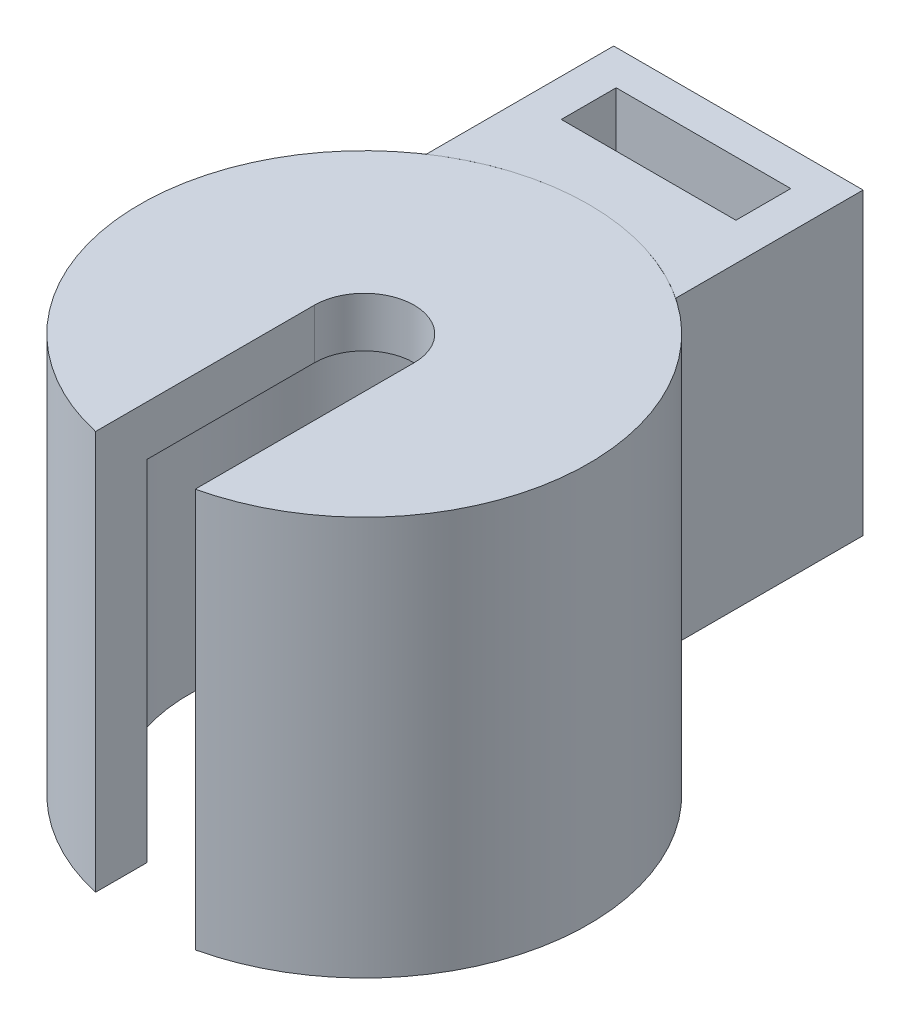
ISO-10303-21;
HEADER;
FILE_DESCRIPTION(('STEP AP214'),'2;1');
FILE_NAME('part.step','',(''),(''),'','','');
FILE_SCHEMA(('AUTOMOTIVE_DESIGN { 1 0 10303 214 1 1 1 1 }'));
ENDSEC;
DATA;
#1=APPLICATION_CONTEXT('core data for automotive mechanical design processes');
#2=APPLICATION_PROTOCOL_DEFINITION('international standard','automotive_design',2000,#1);
#3=PRODUCT_CONTEXT('',#1,'mechanical');
#4=PRODUCT('Part','Part','',(#3));
#5=PRODUCT_RELATED_PRODUCT_CATEGORY('part','',(#4));
#6=PRODUCT_DEFINITION_FORMATION('','',#4);
#7=PRODUCT_DEFINITION_CONTEXT('part definition',#1,'design');
#8=PRODUCT_DEFINITION('design','',#6,#7);
#9=PRODUCT_DEFINITION_SHAPE('','',#8);
#10=(LENGTH_UNIT() NAMED_UNIT(*) SI_UNIT(.MILLI.,.METRE.));
#11=(NAMED_UNIT(*) PLANE_ANGLE_UNIT() SI_UNIT($,.RADIAN.));
#12=(NAMED_UNIT(*) SI_UNIT($,.STERADIAN.) SOLID_ANGLE_UNIT());
#13=UNCERTAINTY_MEASURE_WITH_UNIT(LENGTH_MEASURE(1.E-05),#10,'distance_accuracy_value','');
#14=(GEOMETRIC_REPRESENTATION_CONTEXT(3) GLOBAL_UNCERTAINTY_ASSIGNED_CONTEXT((#13)) GLOBAL_UNIT_ASSIGNED_CONTEXT((#10,
#11,#12)) REPRESENTATION_CONTEXT('',''));
#15=CARTESIAN_POINT('',(0.,0.,0.));
#16=DIRECTION('',(0.,0.,1.));
#17=DIRECTION('',(1.,0.,0.));
#18=AXIS2_PLACEMENT_3D('',#15,#16,#17);
#19=CARTESIAN_POINT('',(0.,7.,0.));
#20=DIRECTION('',(0.,-1.,0.));
#21=DIRECTION('',(0.,0.,-1.));
#22=AXIS2_PLACEMENT_3D('',#19,#20,#21);
#23=CYLINDRICAL_SURFACE('',#22,4.5);
#24=CARTESIAN_POINT('',(0.,0.,0.));
#25=DIRECTION('',(0.,1.,0.));
#26=DIRECTION('',(0.,0.,1.));
#27=AXIS2_PLACEMENT_3D('',#24,#25,#26);
#28=CIRCLE('',#27,4.5);
#29=CARTESIAN_POINT('',(1.,0.,4.38748219369606));
#30=VERTEX_POINT('',#29);
#31=CARTESIAN_POINT('',(-1.,0.,4.38748219369606));
#32=VERTEX_POINT('',#31);
#33=EDGE_CURVE('E264',#30,#32,#28,.T.);
#34=ORIENTED_EDGE('',*,*,#33,.T.);
#35=DIRECTION('',(0.,-1.,0.));
#36=VECTOR('',#35,1.);
#37=CARTESIAN_POINT('',(-1.,7.,4.38748219369606));
#38=LINE('',#37,#36);
#39=CARTESIAN_POINT('',(-1.,8.,4.38748219369606));
#40=VERTEX_POINT('',#39);
#41=EDGE_CURVE('E280',#40,#32,#38,.T.);
#42=ORIENTED_EDGE('',*,*,#41,.F.);
#43=CARTESIAN_POINT('',(0.,8.,0.));
#44=DIRECTION('',(0.,1.,0.));
#45=DIRECTION('',(0.,0.,1.));
#46=AXIS2_PLACEMENT_3D('',#43,#44,#45);
#47=CIRCLE('',#46,4.5);
#48=CARTESIAN_POINT('',(1.,8.,4.38748219369606));
#49=VERTEX_POINT('',#48);
#50=EDGE_CURVE('E231',#49,#40,#47,.T.);
#51=ORIENTED_EDGE('',*,*,#50,.F.);
#52=DIRECTION('',(0.,-1.,0.));
#53=VECTOR('',#52,1.);
#54=CARTESIAN_POINT('',(1.,7.,4.38748219369606));
#55=LINE('',#54,#53);
#56=EDGE_CURVE('E283',#49,#30,#55,.T.);
#57=ORIENTED_EDGE('',*,*,#56,.T.);
#58=EDGE_LOOP('',(#34,#42,#51,#57));
#59=FACE_BOUND('',#58,.T.);
#60=DIRECTION('',(0.,-1.,0.));
#61=VECTOR('',#60,1.);
#62=CARTESIAN_POINT('',(-2.5,7.,-3.74165738677394));
#63=LINE('',#62,#61);
#64=CARTESIAN_POINT('',(-2.5,1.999,-3.74165738677394));
#65=VERTEX_POINT('',#64);
#66=CARTESIAN_POINT('',(-2.5,7.999,-3.74165738677394));
#67=VERTEX_POINT('',#66);
#68=EDGE_CURVE('E11',#65,#67,#63,.F.);
#69=ORIENTED_EDGE('',*,*,#68,.F.);
#70=CARTESIAN_POINT('',(0.,1.999,0.));
#71=DIRECTION('',(0.,-1.,0.));
#72=DIRECTION('',(0.,0.,-1.));
#73=AXIS2_PLACEMENT_3D('',#70,#71,#72);
#74=CIRCLE('',#73,4.5);
#75=CARTESIAN_POINT('',(2.5,1.999,-3.74165738677394));
#76=VERTEX_POINT('',#75);
#77=EDGE_CURVE('E214',#65,#76,#74,.T.);
#78=ORIENTED_EDGE('',*,*,#77,.T.);
#79=DIRECTION('',(0.,-1.,0.));
#80=VECTOR('',#79,1.);
#81=CARTESIAN_POINT('',(2.5,7.,-3.74165738677394));
#82=LINE('',#81,#80);
#83=CARTESIAN_POINT('',(2.5,7.999,-3.74165738677394));
#84=VERTEX_POINT('',#83);
#85=EDGE_CURVE('E287',#76,#84,#82,.F.);
#86=ORIENTED_EDGE('',*,*,#85,.T.);
#87=CARTESIAN_POINT('',(0.,7.999,0.));
#88=DIRECTION('',(0.,-1.,0.));
#89=DIRECTION('',(0.,0.,-1.));
#90=AXIS2_PLACEMENT_3D('',#87,#88,#89);
#91=CIRCLE('',#90,4.5);
#92=EDGE_CURVE('E50',#67,#84,#91,.T.);
#93=ORIENTED_EDGE('',*,*,#92,.F.);
#94=EDGE_LOOP('',(#69,#78,#86,#93));
#95=FACE_BOUND('',#94,.T.);
#96=ADVANCED_FACE('F41',(#59,#95),#23,.T.);
#97=CARTESIAN_POINT('',(1.,7.,0.));
#98=DIRECTION('',(1.,0.,0.));
#99=DIRECTION('',(0.,0.,-1.));
#100=AXIS2_PLACEMENT_3D('',#97,#98,#99);
#101=PLANE('',#100);
#102=DIRECTION('',(0.,0.,1.));
#103=VECTOR('',#102,1.);
#104=CARTESIAN_POINT('',(1.,0.,0.));
#105=LINE('',#104,#103);
#106=CARTESIAN_POINT('',(1.,0.,3.35410196624968));
#107=VERTEX_POINT('',#106);
#108=EDGE_CURVE('E255',#107,#30,#105,.T.);
#109=ORIENTED_EDGE('',*,*,#108,.T.);
#110=ORIENTED_EDGE('',*,*,#56,.F.);
#111=DIRECTION('',(0.,0.,1.));
#112=VECTOR('',#111,1.);
#113=CARTESIAN_POINT('',(1.,8.,0.));
#114=LINE('',#113,#112);
#115=CARTESIAN_POINT('',(1.,8.,0.));
#116=VERTEX_POINT('',#115);
#117=EDGE_CURVE('E226',#116,#49,#114,.T.);
#118=ORIENTED_EDGE('',*,*,#117,.F.);
#119=DIRECTION('',(0.,-1.,0.));
#120=VECTOR('',#119,1.);
#121=CARTESIAN_POINT('',(1.,8.,0.));
#122=LINE('',#121,#120);
#123=CARTESIAN_POINT('',(1.,7.,0.));
#124=VERTEX_POINT('',#123);
#125=EDGE_CURVE('E252',#116,#124,#122,.T.);
#126=ORIENTED_EDGE('',*,*,#125,.T.);
#127=DIRECTION('',(0.,0.,1.));
#128=VECTOR('',#127,1.);
#129=CARTESIAN_POINT('',(1.,7.,0.));
#130=LINE('',#129,#128);
#131=CARTESIAN_POINT('',(1.,7.,3.35410196624968));
#132=VERTEX_POINT('',#131);
#133=EDGE_CURVE('E243',#124,#132,#130,.T.);
#134=ORIENTED_EDGE('',*,*,#133,.T.);
#135=DIRECTION('',(0.,-1.,0.));
#136=VECTOR('',#135,1.);
#137=CARTESIAN_POINT('',(1.,7.,3.35410196624968));
#138=LINE('',#137,#136);
#139=EDGE_CURVE('E259',#132,#107,#138,.T.);
#140=ORIENTED_EDGE('',*,*,#139,.T.);
#141=EDGE_LOOP('',(#109,#110,#118,#126,#134,#140));
#142=FACE_BOUND('',#141,.T.);
#143=ADVANCED_FACE('F43',(#142),#101,.F.);
#144=CARTESIAN_POINT('',(-1.,7.,0.));
#145=DIRECTION('',(1.,0.,0.));
#146=DIRECTION('',(0.,0.,-1.));
#147=AXIS2_PLACEMENT_3D('',#144,#145,#146);
#148=PLANE('',#147);
#149=DIRECTION('',(0.,0.,1.));
#150=VECTOR('',#149,1.);
#151=CARTESIAN_POINT('',(-1.,0.,0.));
#152=LINE('',#151,#150);
#153=CARTESIAN_POINT('',(-1.,0.,3.35410196624968));
#154=VERTEX_POINT('',#153);
#155=EDGE_CURVE('E268',#154,#32,#152,.T.);
#156=ORIENTED_EDGE('',*,*,#155,.F.);
#157=DIRECTION('',(0.,-1.,0.));
#158=VECTOR('',#157,1.);
#159=CARTESIAN_POINT('',(-1.,7.,3.35410196624968));
#160=LINE('',#159,#158);
#161=CARTESIAN_POINT('',(-1.,7.,3.35410196624968));
#162=VERTEX_POINT('',#161);
#163=EDGE_CURVE('E277',#162,#154,#160,.T.);
#164=ORIENTED_EDGE('',*,*,#163,.F.);
#165=DIRECTION('',(0.,0.,1.));
#166=VECTOR('',#165,1.);
#167=CARTESIAN_POINT('',(-1.,7.,0.));
#168=LINE('',#167,#166);
#169=CARTESIAN_POINT('',(-1.,7.,0.));
#170=VERTEX_POINT('',#169);
#171=EDGE_CURVE('E227',#170,#162,#168,.T.);
#172=ORIENTED_EDGE('',*,*,#171,.F.);
#173=DIRECTION('',(0.,-1.,0.));
#174=VECTOR('',#173,1.);
#175=CARTESIAN_POINT('',(-1.,8.,0.));
#176=LINE('',#175,#174);
#177=CARTESIAN_POINT('',(-1.,8.,0.));
#178=VERTEX_POINT('',#177);
#179=EDGE_CURVE('E239',#178,#170,#176,.T.);
#180=ORIENTED_EDGE('',*,*,#179,.F.);
#181=DIRECTION('',(0.,0.,1.));
#182=VECTOR('',#181,1.);
#183=CARTESIAN_POINT('',(-1.,8.,0.));
#184=LINE('',#183,#182);
#185=EDGE_CURVE('E235',#178,#40,#184,.T.);
#186=ORIENTED_EDGE('',*,*,#185,.T.);
#187=ORIENTED_EDGE('',*,*,#41,.T.);
#188=EDGE_LOOP('',(#156,#164,#172,#180,#186,#187));
#189=FACE_BOUND('',#188,.T.);
#190=ADVANCED_FACE('F327',(#189),#148,.T.);
#191=CARTESIAN_POINT('',(0.,7.,0.));
#192=DIRECTION('',(0.,-1.,0.));
#193=DIRECTION('',(0.,0.,-1.));
#194=AXIS2_PLACEMENT_3D('',#191,#192,#193);
#195=CYLINDRICAL_SURFACE('',#194,3.5);
#196=CARTESIAN_POINT('',(0.,0.,0.));
#197=DIRECTION('',(0.,1.,0.));
#198=DIRECTION('',(0.,0.,1.));
#199=AXIS2_PLACEMENT_3D('',#196,#197,#198);
#200=CIRCLE('',#199,3.5);
#201=EDGE_CURVE('E260',#107,#154,#200,.T.);
#202=ORIENTED_EDGE('',*,*,#201,.F.);
#203=ORIENTED_EDGE('',*,*,#139,.F.);
#204=CARTESIAN_POINT('',(0.,7.,0.));
#205=DIRECTION('',(0.,1.,0.));
#206=DIRECTION('',(0.,0.,1.));
#207=AXIS2_PLACEMENT_3D('',#204,#205,#206);
#208=CIRCLE('',#207,3.5);
#209=EDGE_CURVE('E256',#132,#162,#208,.T.);
#210=ORIENTED_EDGE('',*,*,#209,.T.);
#211=ORIENTED_EDGE('',*,*,#163,.T.);
#212=EDGE_LOOP('',(#202,#203,#210,#211));
#213=FACE_BOUND('',#212,.T.);
#214=ADVANCED_FACE('F332',(#213),#195,.F.);
#215=CARTESIAN_POINT('',(0.,0.,0.));
#216=DIRECTION('',(0.,1.,0.));
#217=DIRECTION('',(0.,0.,1.));
#218=AXIS2_PLACEMENT_3D('',#215,#216,#217);
#219=PLANE('',#218);
#220=ORIENTED_EDGE('',*,*,#108,.F.);
#221=ORIENTED_EDGE('',*,*,#201,.T.);
#222=ORIENTED_EDGE('',*,*,#155,.T.);
#223=ORIENTED_EDGE('',*,*,#33,.F.);
#224=EDGE_LOOP('',(#220,#221,#222,#223));
#225=FACE_BOUND('',#224,.T.);
#226=ADVANCED_FACE('F336',(#225),#219,.F.);
#227=CARTESIAN_POINT('',(0.,7.,0.));
#228=DIRECTION('',(0.,1.,0.));
#229=DIRECTION('',(0.,0.,1.));
#230=AXIS2_PLACEMENT_3D('',#227,#228,#229);
#231=PLANE('',#230);
#232=ORIENTED_EDGE('',*,*,#209,.F.);
#233=ORIENTED_EDGE('',*,*,#133,.F.);
#234=CARTESIAN_POINT('',(0.,7.,0.));
#235=DIRECTION('',(0.,1.,0.));
#236=DIRECTION('',(0.,0.,1.));
#237=AXIS2_PLACEMENT_3D('',#234,#235,#236);
#238=CIRCLE('',#237,1.);
#239=EDGE_CURVE('E221',#124,#170,#238,.T.);
#240=ORIENTED_EDGE('',*,*,#239,.T.);
#241=ORIENTED_EDGE('',*,*,#171,.T.);
#242=EDGE_LOOP('',(#232,#233,#240,#241));
#243=FACE_BOUND('',#242,.T.);
#244=ADVANCED_FACE('F340',(#243),#231,.F.);
#245=CARTESIAN_POINT('',(0.,8.,0.));
#246=DIRECTION('',(0.,-1.,0.));
#247=DIRECTION('',(0.,0.,-1.));
#248=AXIS2_PLACEMENT_3D('',#245,#246,#247);
#249=CYLINDRICAL_SURFACE('',#248,1.);
#250=ORIENTED_EDGE('',*,*,#239,.F.);
#251=ORIENTED_EDGE('',*,*,#125,.F.);
#252=CARTESIAN_POINT('',(0.,8.,0.));
#253=DIRECTION('',(0.,1.,0.));
#254=DIRECTION('',(0.,0.,1.));
#255=AXIS2_PLACEMENT_3D('',#252,#253,#254);
#256=CIRCLE('',#255,1.);
#257=EDGE_CURVE('E222',#116,#178,#256,.T.);
#258=ORIENTED_EDGE('',*,*,#257,.T.);
#259=ORIENTED_EDGE('',*,*,#179,.T.);
#260=EDGE_LOOP('',(#250,#251,#258,#259));
#261=FACE_BOUND('',#260,.T.);
#262=ADVANCED_FACE('F318',(#261),#249,.F.);
#263=CARTESIAN_POINT('',(0.,8.,0.));
#264=DIRECTION('',(0.,1.,0.));
#265=DIRECTION('',(0.,0.,1.));
#266=AXIS2_PLACEMENT_3D('',#263,#264,#265);
#267=PLANE('',#266);
#268=ORIENTED_EDGE('',*,*,#257,.F.);
#269=ORIENTED_EDGE('',*,*,#117,.T.);
#270=ORIENTED_EDGE('',*,*,#50,.T.);
#271=ORIENTED_EDGE('',*,*,#185,.F.);
#272=EDGE_LOOP('',(#268,#269,#270,#271));
#273=FACE_BOUND('',#272,.T.);
#274=ADVANCED_FACE('F311',(#273),#267,.T.);
#275=CARTESIAN_POINT('',(-2.5,0.,0.));
#276=DIRECTION('',(1.,0.,0.));
#277=DIRECTION('',(0.,0.,-1.));
#278=AXIS2_PLACEMENT_3D('',#275,#276,#277);
#279=PLANE('',#278);
#280=DIRECTION('',(0.,0.,-1.));
#281=VECTOR('',#280,1.);
#282=CARTESIAN_POINT('',(-2.5,1.999,0.));
#283=LINE('',#282,#281);
#284=CARTESIAN_POINT('',(-2.5,1.999,-7.5));
#285=VERTEX_POINT('',#284);
#286=EDGE_CURVE('E206',#65,#285,#283,.T.);
#287=ORIENTED_EDGE('',*,*,#286,.F.);
#288=ORIENTED_EDGE('',*,*,#68,.T.);
#289=DIRECTION('',(0.,0.,-1.));
#290=VECTOR('',#289,1.);
#291=CARTESIAN_POINT('',(-2.5,7.999,0.));
#292=LINE('',#291,#290);
#293=CARTESIAN_POINT('',(-2.5,7.999,-7.5));
#294=VERTEX_POINT('',#293);
#295=EDGE_CURVE('E203',#67,#294,#292,.T.);
#296=ORIENTED_EDGE('',*,*,#295,.T.);
#297=DIRECTION('',(0.,-1.,0.));
#298=VECTOR('',#297,1.);
#299=CARTESIAN_POINT('',(-2.5,0.,-7.5));
#300=LINE('',#299,#298);
#301=EDGE_CURVE('E199',#294,#285,#300,.T.);
#302=ORIENTED_EDGE('',*,*,#301,.T.);
#303=EDGE_LOOP('',(#287,#288,#296,#302));
#304=FACE_BOUND('',#303,.T.);
#305=ADVANCED_FACE('F309',(#304),#279,.F.);
#306=CARTESIAN_POINT('',(2.5,0.,0.));
#307=DIRECTION('',(1.,0.,0.));
#308=DIRECTION('',(0.,0.,-1.));
#309=AXIS2_PLACEMENT_3D('',#306,#307,#308);
#310=PLANE('',#309);
#311=ORIENTED_EDGE('',*,*,#85,.F.);
#312=DIRECTION('',(0.,0.,-1.));
#313=VECTOR('',#312,1.);
#314=CARTESIAN_POINT('',(2.5,1.999,0.));
#315=LINE('',#314,#313);
#316=CARTESIAN_POINT('',(2.5,1.999,-7.5));
#317=VERTEX_POINT('',#316);
#318=EDGE_CURVE('E196',#76,#317,#315,.T.);
#319=ORIENTED_EDGE('',*,*,#318,.T.);
#320=DIRECTION('',(0.,-1.,0.));
#321=VECTOR('',#320,1.);
#322=CARTESIAN_POINT('',(2.5,0.,-7.5));
#323=LINE('',#322,#321);
#324=CARTESIAN_POINT('',(2.5,7.999,-7.5));
#325=VERTEX_POINT('',#324);
#326=EDGE_CURVE('E189',#325,#317,#323,.T.);
#327=ORIENTED_EDGE('',*,*,#326,.F.);
#328=DIRECTION('',(0.,0.,-1.));
#329=VECTOR('',#328,1.);
#330=CARTESIAN_POINT('',(2.5,7.999,0.));
#331=LINE('',#330,#329);
#332=EDGE_CURVE('E193',#84,#325,#331,.T.);
#333=ORIENTED_EDGE('',*,*,#332,.F.);
#334=EDGE_LOOP('',(#311,#319,#327,#333));
#335=FACE_BOUND('',#334,.T.);
#336=ADVANCED_FACE('F299',(#335),#310,.T.);
#337=CARTESIAN_POINT('',(-2.5,0.,-7.5));
#338=DIRECTION('',(0.,0.,1.));
#339=DIRECTION('',(0.,-1.,0.));
#340=AXIS2_PLACEMENT_3D('',#337,#338,#339);
#341=PLANE('',#340);
#342=DIRECTION('',(1.,0.,0.));
#343=VECTOR('',#342,1.);
#344=CARTESIAN_POINT('',(-2.5,7.999,-7.5));
#345=LINE('',#344,#343);
#346=EDGE_CURVE('E209',#294,#325,#345,.T.);
#347=ORIENTED_EDGE('',*,*,#346,.T.);
#348=ORIENTED_EDGE('',*,*,#326,.T.);
#349=DIRECTION('',(1.,0.,0.));
#350=VECTOR('',#349,1.);
#351=CARTESIAN_POINT('',(-2.5,1.999,-7.5));
#352=LINE('',#351,#350);
#353=EDGE_CURVE('E210',#285,#317,#352,.T.);
#354=ORIENTED_EDGE('',*,*,#353,.F.);
#355=ORIENTED_EDGE('',*,*,#301,.F.);
#356=EDGE_LOOP('',(#347,#348,#354,#355));
#357=FACE_BOUND('',#356,.T.);
#358=ADVANCED_FACE('F307',(#357),#341,.F.);
#359=CARTESIAN_POINT('',(-2.5,1.999,0.));
#360=DIRECTION('',(0.,-1.,0.));
#361=DIRECTION('',(0.,0.,-1.));
#362=AXIS2_PLACEMENT_3D('',#359,#360,#361);
#363=PLANE('',#362);
#364=DIRECTION('',(1.,0.,0.));
#365=VECTOR('',#364,1.);
#366=CARTESIAN_POINT('',(-2.5,1.999,-6.80000000000001));
#367=LINE('',#366,#365);
#368=CARTESIAN_POINT('',(-1.75,1.999,-6.80000000000001));
#369=VERTEX_POINT('',#368);
#370=CARTESIAN_POINT('',(1.75,1.999,-6.80000000000001));
#371=VERTEX_POINT('',#370);
#372=EDGE_CURVE('E186',#369,#371,#367,.T.);
#373=ORIENTED_EDGE('',*,*,#372,.F.);
#374=DIRECTION('',(0.,0.,-1.));
#375=VECTOR('',#374,1.);
#376=CARTESIAN_POINT('',(-1.75,1.999,0.));
#377=LINE('',#376,#375);
#378=CARTESIAN_POINT('',(-1.75,1.999,-5.70000000000001));
#379=VERTEX_POINT('',#378);
#380=EDGE_CURVE('E173',#379,#369,#377,.T.);
#381=ORIENTED_EDGE('',*,*,#380,.F.);
#382=DIRECTION('',(1.,0.,0.));
#383=VECTOR('',#382,1.);
#384=CARTESIAN_POINT('',(-2.5,1.999,-5.70000000000001));
#385=LINE('',#384,#383);
#386=CARTESIAN_POINT('',(1.75,1.999,-5.70000000000001));
#387=VERTEX_POINT('',#386);
#388=EDGE_CURVE('E148',#379,#387,#385,.T.);
#389=ORIENTED_EDGE('',*,*,#388,.T.);
#390=DIRECTION('',(0.,0.,-1.));
#391=VECTOR('',#390,1.);
#392=CARTESIAN_POINT('',(1.75,1.999,0.));
#393=LINE('',#392,#391);
#394=EDGE_CURVE('E182',#387,#371,#393,.T.);
#395=ORIENTED_EDGE('',*,*,#394,.T.);
#396=EDGE_LOOP('',(#373,#381,#389,#395));
#397=FACE_BOUND('',#396,.T.);
#398=ORIENTED_EDGE('',*,*,#77,.F.);
#399=ORIENTED_EDGE('',*,*,#286,.T.);
#400=ORIENTED_EDGE('',*,*,#353,.T.);
#401=ORIENTED_EDGE('',*,*,#318,.F.);
#402=EDGE_LOOP('',(#398,#399,#400,#401));
#403=FACE_BOUND('',#402,.T.);
#404=ADVANCED_FACE('F302',(#397,#403),#363,.T.);
#405=CARTESIAN_POINT('',(-2.5,7.999,0.));
#406=DIRECTION('',(0.,-1.,0.));
#407=DIRECTION('',(0.,0.,-1.));
#408=AXIS2_PLACEMENT_3D('',#405,#406,#407);
#409=PLANE('',#408);
#410=DIRECTION('',(0.,0.,1.));
#411=VECTOR('',#410,1.);
#412=CARTESIAN_POINT('',(-1.75,7.999,0.));
#413=LINE('',#412,#411);
#414=CARTESIAN_POINT('',(-1.75,7.999,-6.80000000000001));
#415=VERTEX_POINT('',#414);
#416=CARTESIAN_POINT('',(-1.75,7.999,-5.70000000000001));
#417=VERTEX_POINT('',#416);
#418=EDGE_CURVE('E155',#415,#417,#413,.T.);
#419=ORIENTED_EDGE('',*,*,#418,.F.);
#420=DIRECTION('',(-1.,0.,0.));
#421=VECTOR('',#420,1.);
#422=CARTESIAN_POINT('',(0.,7.999,-6.80000000000001));
#423=LINE('',#422,#421);
#424=CARTESIAN_POINT('',(1.75,7.999,-6.80000000000001));
#425=VERTEX_POINT('',#424);
#426=EDGE_CURVE('E65',#425,#415,#423,.T.);
#427=ORIENTED_EDGE('',*,*,#426,.F.);
#428=DIRECTION('',(0.,0.,1.));
#429=VECTOR('',#428,1.);
#430=CARTESIAN_POINT('',(1.75,7.999,0.));
#431=LINE('',#430,#429);
#432=CARTESIAN_POINT('',(1.75,7.999,-5.70000000000001));
#433=VERTEX_POINT('',#432);
#434=EDGE_CURVE('E163',#425,#433,#431,.T.);
#435=ORIENTED_EDGE('',*,*,#434,.T.);
#436=DIRECTION('',(-1.,0.,0.));
#437=VECTOR('',#436,1.);
#438=CARTESIAN_POINT('',(0.,7.999,-5.70000000000001));
#439=LINE('',#438,#437);
#440=EDGE_CURVE('E145',#433,#417,#439,.T.);
#441=ORIENTED_EDGE('',*,*,#440,.T.);
#442=EDGE_LOOP('',(#419,#427,#435,#441));
#443=FACE_BOUND('',#442,.T.);
#444=ORIENTED_EDGE('',*,*,#295,.F.);
#445=ORIENTED_EDGE('',*,*,#92,.T.);
#446=ORIENTED_EDGE('',*,*,#332,.T.);
#447=ORIENTED_EDGE('',*,*,#346,.F.);
#448=EDGE_LOOP('',(#444,#445,#446,#447));
#449=FACE_BOUND('',#448,.T.);
#450=ADVANCED_FACE('F160',(#443,#449),#409,.F.);
#451=CARTESIAN_POINT('',(0.,0.998999999999999,-6.80000000000001));
#452=DIRECTION('',(0.,0.,-1.));
#453=DIRECTION('',(-1.,0.,0.));
#454=AXIS2_PLACEMENT_3D('',#451,#452,#453);
#455=PLANE('',#454);
#456=ORIENTED_EDGE('',*,*,#372,.T.);
#457=DIRECTION('',(0.,1.,0.));
#458=VECTOR('',#457,1.);
#459=CARTESIAN_POINT('',(1.75,0.998999999999999,-6.80000000000001));
#460=LINE('',#459,#458);
#461=EDGE_CURVE('E170',#371,#425,#460,.T.);
#462=ORIENTED_EDGE('',*,*,#461,.T.);
#463=ORIENTED_EDGE('',*,*,#426,.T.);
#464=DIRECTION('',(0.,1.,0.));
#465=VECTOR('',#464,1.);
#466=CARTESIAN_POINT('',(-1.75,0.998999999999999,-6.80000000000001));
#467=LINE('',#466,#465);
#468=EDGE_CURVE('E152',#369,#415,#467,.T.);
#469=ORIENTED_EDGE('',*,*,#468,.F.);
#470=EDGE_LOOP('',(#456,#462,#463,#469));
#471=FACE_BOUND('',#470,.T.);
#472=ADVANCED_FACE('F351',(#471),#455,.F.);
#473=CARTESIAN_POINT('',(1.75,0.998999999999999,0.));
#474=DIRECTION('',(-1.,0.,0.));
#475=DIRECTION('',(0.,0.,1.));
#476=AXIS2_PLACEMENT_3D('',#473,#474,#475);
#477=PLANE('',#476);
#478=DIRECTION('',(0.,1.,0.));
#479=VECTOR('',#478,1.);
#480=CARTESIAN_POINT('',(1.75,0.998999999999999,-5.70000000000001));
#481=LINE('',#480,#479);
#482=EDGE_CURVE('E151',#387,#433,#481,.T.);
#483=ORIENTED_EDGE('',*,*,#482,.T.);
#484=ORIENTED_EDGE('',*,*,#434,.F.);
#485=ORIENTED_EDGE('',*,*,#461,.F.);
#486=ORIENTED_EDGE('',*,*,#394,.F.);
#487=EDGE_LOOP('',(#483,#484,#485,#486));
#488=FACE_BOUND('',#487,.T.);
#489=ADVANCED_FACE('F359',(#488),#477,.T.);
#490=CARTESIAN_POINT('',(0.,0.998999999999999,-5.70000000000001));
#491=DIRECTION('',(0.,0.,-1.));
#492=DIRECTION('',(-1.,0.,0.));
#493=AXIS2_PLACEMENT_3D('',#490,#491,#492);
#494=PLANE('',#493);
#495=DIRECTION('',(0.,1.,0.));
#496=VECTOR('',#495,1.);
#497=CARTESIAN_POINT('',(-1.75,0.998999999999999,-5.70000000000001));
#498=LINE('',#497,#496);
#499=EDGE_CURVE('E57',#379,#417,#498,.T.);
#500=ORIENTED_EDGE('',*,*,#499,.T.);
#501=ORIENTED_EDGE('',*,*,#440,.F.);
#502=ORIENTED_EDGE('',*,*,#482,.F.);
#503=ORIENTED_EDGE('',*,*,#388,.F.);
#504=EDGE_LOOP('',(#500,#501,#502,#503));
#505=FACE_BOUND('',#504,.T.);
#506=ADVANCED_FACE('F142',(#505),#494,.T.);
#507=CARTESIAN_POINT('',(-1.75,0.998999999999999,0.));
#508=DIRECTION('',(-1.,0.,0.));
#509=DIRECTION('',(0.,0.,1.));
#510=AXIS2_PLACEMENT_3D('',#507,#508,#509);
#511=PLANE('',#510);
#512=ORIENTED_EDGE('',*,*,#380,.T.);
#513=ORIENTED_EDGE('',*,*,#468,.T.);
#514=ORIENTED_EDGE('',*,*,#418,.T.);
#515=ORIENTED_EDGE('',*,*,#499,.F.);
#516=EDGE_LOOP('',(#512,#513,#514,#515));
#517=FACE_BOUND('',#516,.T.);
#518=ADVANCED_FACE('F156',(#517),#511,.F.);
#519=CLOSED_SHELL('',(#96,#143,#190,#214,#226,#244,#262,#274,#305,#336,#358,#404,#450,#472,#489,
#506,#518));
#520=MANIFOLD_SOLID_BREP('B2',#519);
#521=ADVANCED_BREP_SHAPE_REPRESENTATION('',(#18,#520),#14);
#522=SHAPE_DEFINITION_REPRESENTATION(#9,#521);
ENDSEC;
END-ISO-10303-21;
